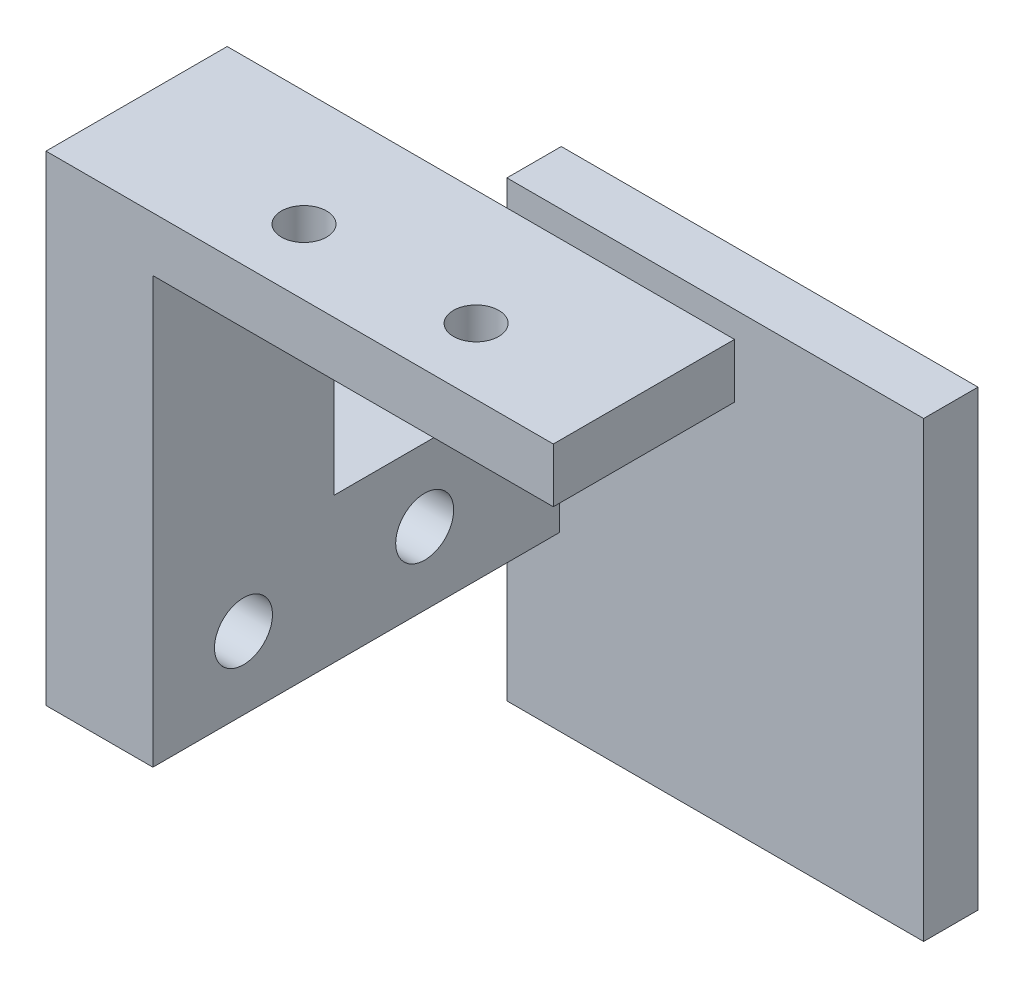
ISO-10303-21;
HEADER;
FILE_DESCRIPTION(('STEP AP214'),'2;1');
FILE_NAME('part.step','',(''),(''),'','','');
FILE_SCHEMA(('AUTOMOTIVE_DESIGN { 1 0 10303 214 1 1 1 1 }'));
ENDSEC;
DATA;
#1=APPLICATION_CONTEXT('core data for automotive mechanical design processes');
#2=APPLICATION_PROTOCOL_DEFINITION('international standard','automotive_design',2000,#1);
#3=PRODUCT_CONTEXT('',#1,'mechanical');
#4=PRODUCT('Part','Part','',(#3));
#5=PRODUCT_RELATED_PRODUCT_CATEGORY('part','',(#4));
#6=PRODUCT_DEFINITION_FORMATION('','',#4);
#7=PRODUCT_DEFINITION_CONTEXT('part definition',#1,'design');
#8=PRODUCT_DEFINITION('design','',#6,#7);
#9=PRODUCT_DEFINITION_SHAPE('','',#8);
#10=(LENGTH_UNIT() NAMED_UNIT(*) SI_UNIT(.MILLI.,.METRE.));
#11=(NAMED_UNIT(*) PLANE_ANGLE_UNIT() SI_UNIT($,.RADIAN.));
#12=(NAMED_UNIT(*) SI_UNIT($,.STERADIAN.) SOLID_ANGLE_UNIT());
#13=UNCERTAINTY_MEASURE_WITH_UNIT(LENGTH_MEASURE(1.E-05),#10,'distance_accuracy_value','');
#14=(GEOMETRIC_REPRESENTATION_CONTEXT(3) GLOBAL_UNCERTAINTY_ASSIGNED_CONTEXT((#13)) GLOBAL_UNIT_ASSIGNED_CONTEXT((#10,
#11,#12)) REPRESENTATION_CONTEXT('',''));
#15=CARTESIAN_POINT('',(0.,0.,0.));
#16=DIRECTION('',(0.,0.,1.));
#17=DIRECTION('',(1.,0.,0.));
#18=AXIS2_PLACEMENT_3D('',#15,#16,#17);
#19=CARTESIAN_POINT('',(10.5,-31.8597532218931,-17.4390504171813));
#20=DIRECTION('',(0.,0.,-1.));
#21=DIRECTION('',(-1.,0.,0.));
#22=AXIS2_PLACEMENT_3D('',#19,#20,#21);
#23=PLANE('',#22);
#24=DIRECTION('',(-1.,0.,0.));
#25=VECTOR('',#24,1.);
#26=CARTESIAN_POINT('',(-9.6,-14.3599627835551,-17.4390504171813));
#27=LINE('',#26,#25);
#28=CARTESIAN_POINT('',(-9.6,-14.3599627835551,-17.4390504171813));
#29=VERTEX_POINT('',#28);
#30=CARTESIAN_POINT('',(-12.5,-14.3599627835551,-17.4390504171813));
#31=VERTEX_POINT('',#30);
#32=EDGE_CURVE('E66',#29,#31,#27,.T.);
#33=ORIENTED_EDGE('',*,*,#32,.F.);
#34=DIRECTION('',(0.,1.,0.));
#35=VECTOR('',#34,1.);
#36=CARTESIAN_POINT('',(-9.6,-14.3599627835551,-17.4390504171813));
#37=LINE('',#36,#35);
#38=CARTESIAN_POINT('',(-9.6,-22.36,-17.4390504171813));
#39=VERTEX_POINT('',#38);
#40=EDGE_CURVE('E433',#39,#29,#37,.T.);
#41=ORIENTED_EDGE('',*,*,#40,.F.);
#42=DIRECTION('',(-1.,0.,0.));
#43=VECTOR('',#42,1.);
#44=CARTESIAN_POINT('',(-9.6,-22.36,-17.4390504171813));
#45=LINE('',#44,#43);
#46=CARTESIAN_POINT('',(-12.5,-22.36,-17.4390504171813));
#47=VERTEX_POINT('',#46);
#48=EDGE_CURVE('E449',#39,#47,#45,.T.);
#49=ORIENTED_EDGE('',*,*,#48,.T.);
#50=DIRECTION('',(0.,-1.,0.));
#51=VECTOR('',#50,1.);
#52=CARTESIAN_POINT('',(-12.5,-31.8597532218931,-17.4390504171813));
#53=LINE('',#52,#51);
#54=CARTESIAN_POINT('',(-12.5,-31.8597532218931,-17.4390504171813));
#55=VERTEX_POINT('',#54);
#56=EDGE_CURVE('E314',#47,#55,#53,.T.);
#57=ORIENTED_EDGE('',*,*,#56,.T.);
#58=DIRECTION('',(-1.,0.,0.));
#59=VECTOR('',#58,1.);
#60=CARTESIAN_POINT('',(10.5,-31.8597532218931,-17.4390504171813));
#61=LINE('',#60,#59);
#62=CARTESIAN_POINT('',(10.5,-31.8597532218931,-17.4390504171813));
#63=VERTEX_POINT('',#62);
#64=EDGE_CURVE('E363',#63,#55,#61,.T.);
#65=ORIENTED_EDGE('',*,*,#64,.F.);
#66=DIRECTION('',(0.,-1.,0.));
#67=VECTOR('',#66,1.);
#68=CARTESIAN_POINT('',(10.5,-31.8597532218931,-17.4390504171813));
#69=LINE('',#68,#67);
#70=CARTESIAN_POINT('',(10.5,-6.85975322189306,-17.4390504171813));
#71=VERTEX_POINT('',#70);
#72=EDGE_CURVE('E323',#71,#63,#69,.T.);
#73=ORIENTED_EDGE('',*,*,#72,.F.);
#74=DIRECTION('',(-1.,0.,0.));
#75=VECTOR('',#74,1.);
#76=CARTESIAN_POINT('',(10.5,-6.85975322189306,-17.4390504171813));
#77=LINE('',#76,#75);
#78=CARTESIAN_POINT('',(-12.5,-6.85975322189306,-17.4390504171813));
#79=VERTEX_POINT('',#78);
#80=EDGE_CURVE('E337',#71,#79,#77,.T.);
#81=ORIENTED_EDGE('',*,*,#80,.T.);
#82=EDGE_CURVE('E338',#79,#31,#53,.T.);
#83=ORIENTED_EDGE('',*,*,#82,.T.);
#84=EDGE_LOOP('',(#33,#41,#49,#57,#65,#73,#81,#83));
#85=FACE_BOUND('',#84,.T.);
#86=ADVANCED_FACE('F48',(#85),#23,.F.);
#87=CARTESIAN_POINT('',(-12.5,0.,0.));
#88=DIRECTION('',(-1.,0.,0.));
#89=DIRECTION('',(0.,0.,1.));
#90=AXIS2_PLACEMENT_3D('',#87,#88,#89);
#91=PLANE('',#90);
#92=DIRECTION('',(0.,1.,0.));
#93=VECTOR('',#92,1.);
#94=CARTESIAN_POINT('',(-12.5,-31.8597532218931,-20.4390504171812));
#95=LINE('',#94,#93);
#96=CARTESIAN_POINT('',(-12.5,-14.3599604516055,-20.4390504171812));
#97=VERTEX_POINT('',#96);
#98=CARTESIAN_POINT('',(-12.5,-6.85975322189306,-20.4390504171812));
#99=VERTEX_POINT('',#98);
#100=EDGE_CURVE('E345',#97,#99,#95,.T.);
#101=ORIENTED_EDGE('',*,*,#100,.F.);
#102=DIRECTION('',(0.,-1.55463304628297E-06,0.999999999998792));
#103=VECTOR('',#102,1.);
#104=CARTESIAN_POINT('',(-12.5,-14.359992226794,-2.23245184601676E-05));
#105=LINE('',#104,#103);
#106=EDGE_CURVE('E11',#97,#31,#105,.T.);
#107=ORIENTED_EDGE('',*,*,#106,.T.);
#108=ORIENTED_EDGE('',*,*,#82,.F.);
#109=DIRECTION('',(0.,0.,1.));
#110=VECTOR('',#109,1.);
#111=CARTESIAN_POINT('',(-12.5,-6.85975322189306,-17.4390504171813));
#112=LINE('',#111,#110);
#113=EDGE_CURVE('E328',#99,#79,#112,.T.);
#114=ORIENTED_EDGE('',*,*,#113,.F.);
#115=EDGE_LOOP('',(#101,#107,#108,#114));
#116=FACE_BOUND('',#115,.T.);
#117=ADVANCED_FACE('F275',(#116),#91,.T.);
#118=CARTESIAN_POINT('',(12.5,3.,5.));
#119=DIRECTION('',(-1.,0.,0.));
#120=DIRECTION('',(0.,0.,1.));
#121=AXIS2_PLACEMENT_3D('',#118,#119,#120);
#122=PLANE('',#121);
#123=DIRECTION('',(0.,-1.,0.));
#124=VECTOR('',#123,1.);
#125=CARTESIAN_POINT('',(12.5,3.,5.));
#126=LINE('',#125,#124);
#127=CARTESIAN_POINT('',(12.5,4.14024677810694,5.));
#128=VERTEX_POINT('',#127);
#129=CARTESIAN_POINT('',(12.5,1.14,5.));
#130=VERTEX_POINT('',#129);
#131=EDGE_CURVE('E197',#128,#130,#126,.T.);
#132=ORIENTED_EDGE('',*,*,#131,.T.);
#133=DIRECTION('',(0.,0.,-1.));
#134=VECTOR('',#133,1.);
#135=CARTESIAN_POINT('',(12.5,1.14,5.));
#136=LINE('',#135,#134);
#137=CARTESIAN_POINT('',(12.5,1.14,-5.));
#138=VERTEX_POINT('',#137);
#139=EDGE_CURVE('E182',#130,#138,#136,.T.);
#140=ORIENTED_EDGE('',*,*,#139,.T.);
#141=DIRECTION('',(0.,-1.,0.));
#142=VECTOR('',#141,1.);
#143=CARTESIAN_POINT('',(12.5,3.,-5.));
#144=LINE('',#143,#142);
#145=CARTESIAN_POINT('',(12.5,4.14024677810694,-5.));
#146=VERTEX_POINT('',#145);
#147=EDGE_CURVE('E58',#146,#138,#144,.T.);
#148=ORIENTED_EDGE('',*,*,#147,.F.);
#149=DIRECTION('',(0.,0.,-1.));
#150=VECTOR('',#149,1.);
#151=CARTESIAN_POINT('',(12.5,4.14024677810694,5.));
#152=LINE('',#151,#150);
#153=EDGE_CURVE('E204',#128,#146,#152,.T.);
#154=ORIENTED_EDGE('',*,*,#153,.F.);
#155=EDGE_LOOP('',(#132,#140,#148,#154));
#156=FACE_BOUND('',#155,.T.);
#157=ADVANCED_FACE('F50',(#156),#122,.F.);
#158=CARTESIAN_POINT('',(-12.5,3.,-5.));
#159=DIRECTION('',(0.,0.,1.));
#160=DIRECTION('',(1.,0.,0.));
#161=AXIS2_PLACEMENT_3D('',#158,#159,#160);
#162=PLANE('',#161);
#163=ORIENTED_EDGE('',*,*,#147,.T.);
#164=DIRECTION('',(1.,0.,0.));
#165=VECTOR('',#164,1.);
#166=CARTESIAN_POINT('',(10.4647507305861,1.14,-5.));
#167=LINE('',#166,#165);
#168=CARTESIAN_POINT('',(-9.6,1.14,-5.));
#169=VERTEX_POINT('',#168);
#170=EDGE_CURVE('E189',#169,#138,#167,.T.);
#171=ORIENTED_EDGE('',*,*,#170,.F.);
#172=DIRECTION('',(0.,1.,0.));
#173=VECTOR('',#172,1.);
#174=CARTESIAN_POINT('',(-9.6,1.14,-5.));
#175=LINE('',#174,#173);
#176=CARTESIAN_POINT('',(-9.6,0.,-5.));
#177=VERTEX_POINT('',#176);
#178=EDGE_CURVE('E546',#177,#169,#175,.T.);
#179=ORIENTED_EDGE('',*,*,#178,.F.);
#180=DIRECTION('',(-1.,0.,0.));
#181=VECTOR('',#180,1.);
#182=CARTESIAN_POINT('',(-9.6,0.,-5.));
#183=LINE('',#182,#181);
#184=CARTESIAN_POINT('',(-12.5,0.,-5.));
#185=VERTEX_POINT('',#184);
#186=EDGE_CURVE('E455',#177,#185,#183,.T.);
#187=ORIENTED_EDGE('',*,*,#186,.T.);
#188=DIRECTION('',(0.,-1.,0.));
#189=VECTOR('',#188,1.);
#190=CARTESIAN_POINT('',(-12.5,0.,-5.));
#191=LINE('',#190,#189);
#192=CARTESIAN_POINT('',(-12.5,-19.359984453629,-5.00002607117806));
#193=VERTEX_POINT('',#192);
#194=EDGE_CURVE('E222',#185,#193,#191,.T.);
#195=ORIENTED_EDGE('',*,*,#194,.T.);
#196=CARTESIAN_POINT('',(-15.5,-19.3599844536155,-5.00003476157075));
#197=DIRECTION('',(1.,0.,0.));
#198=VECTOR('',#197,1.);
#199=LINE('',#196,#198);
#200=CARTESIAN_POINT('',(-15.5,-19.3599863969338,-5.00001738078537));
#201=VERTEX_POINT('',#200);
#202=EDGE_CURVE('E235',#201,#193,#199,.T.);
#203=ORIENTED_EDGE('',*,*,#202,.F.);
#204=DIRECTION('',(0.,-1.,0.));
#205=VECTOR('',#204,1.);
#206=CARTESIAN_POINT('',(-15.5,0.,-5.));
#207=LINE('',#206,#205);
#208=CARTESIAN_POINT('',(-15.5,4.14024677810694,-5.));
#209=VERTEX_POINT('',#208);
#210=EDGE_CURVE('E214',#209,#201,#207,.T.);
#211=ORIENTED_EDGE('',*,*,#210,.F.);
#212=DIRECTION('',(1.,0.,0.));
#213=VECTOR('',#212,1.);
#214=CARTESIAN_POINT('',(12.5,4.14024677810694,-5.));
#215=LINE('',#214,#213);
#216=EDGE_CURVE('E418',#209,#146,#215,.T.);
#217=ORIENTED_EDGE('',*,*,#216,.T.);
#218=EDGE_LOOP('',(#163,#171,#179,#187,#195,#203,#211,#217));
#219=FACE_BOUND('',#218,.T.);
#220=ADVANCED_FACE('F240',(#219),#162,.F.);
#221=CARTESIAN_POINT('',(-12.5,3.,5.));
#222=DIRECTION('',(0.,0.,-1.));
#223=DIRECTION('',(-1.,0.,0.));
#224=AXIS2_PLACEMENT_3D('',#221,#222,#223);
#225=PLANE('',#224);
#226=DIRECTION('',(0.,-1.,0.));
#227=VECTOR('',#226,1.);
#228=CARTESIAN_POINT('',(-9.6,-22.36,5.));
#229=LINE('',#228,#227);
#230=CARTESIAN_POINT('',(-9.6,1.14,5.));
#231=VERTEX_POINT('',#230);
#232=CARTESIAN_POINT('',(-9.6,-22.36,5.));
#233=VERTEX_POINT('',#232);
#234=EDGE_CURVE('E200',#231,#233,#229,.T.);
#235=ORIENTED_EDGE('',*,*,#234,.F.);
#236=DIRECTION('',(1.,0.,0.));
#237=VECTOR('',#236,1.);
#238=CARTESIAN_POINT('',(12.5,1.14,5.));
#239=LINE('',#238,#237);
#240=EDGE_CURVE('E186',#231,#130,#239,.T.);
#241=ORIENTED_EDGE('',*,*,#240,.T.);
#242=ORIENTED_EDGE('',*,*,#131,.F.);
#243=DIRECTION('',(1.,0.,0.));
#244=VECTOR('',#243,1.);
#245=CARTESIAN_POINT('',(12.5,4.14024677810694,5.));
#246=LINE('',#245,#244);
#247=CARTESIAN_POINT('',(-15.5,4.14024677810694,5.));
#248=VERTEX_POINT('',#247);
#249=EDGE_CURVE('E416',#248,#128,#246,.T.);
#250=ORIENTED_EDGE('',*,*,#249,.F.);
#251=DIRECTION('',(0.,1.,0.));
#252=VECTOR('',#251,1.);
#253=CARTESIAN_POINT('',(-15.5,0.,5.));
#254=LINE('',#253,#252);
#255=CARTESIAN_POINT('',(-15.5,-22.36,5.));
#256=VERTEX_POINT('',#255);
#257=EDGE_CURVE('E73',#256,#248,#254,.T.);
#258=ORIENTED_EDGE('',*,*,#257,.F.);
#259=DIRECTION('',(-1.,0.,0.));
#260=VECTOR('',#259,1.);
#261=CARTESIAN_POINT('',(-12.5,-22.36,5.));
#262=LINE('',#261,#260);
#263=EDGE_CURVE('E227',#233,#256,#262,.T.);
#264=ORIENTED_EDGE('',*,*,#263,.F.);
#265=EDGE_LOOP('',(#235,#241,#242,#250,#258,#264));
#266=FACE_BOUND('',#265,.T.);
#267=ADVANCED_FACE('F196',(#266),#225,.F.);
#268=CARTESIAN_POINT('',(-15.5,0.,0.));
#269=DIRECTION('',(1.,0.,0.));
#270=DIRECTION('',(0.,0.,-1.));
#271=AXIS2_PLACEMENT_3D('',#268,#269,#270);
#272=PLANE('',#271);
#273=CARTESIAN_POINT('',(-15.5,-18.3599863310528,-1.82108169364571E-05));
#274=DIRECTION('',(-1.,0.,0.));
#275=DIRECTION('',(0.,0.,1.));
#276=AXIS2_PLACEMENT_3D('',#273,#274,#275);
#277=CIRCLE('',#276,1.6);
#278=CARTESIAN_POINT('',(-15.5,-18.3599863310528,1.59998178918306));
#279=VERTEX_POINT('',#278);
#280=EDGE_CURVE('E577',#279,#279,#277,.T.);
#281=ORIENTED_EDGE('',*,*,#280,.F.);
#282=EDGE_LOOP('',(#281));
#283=FACE_BOUND('',#282,.T.);
#284=CARTESIAN_POINT('',(-15.5,-18.3599922268108,-10.0000134942028));
#285=DIRECTION('',(-1.,0.,0.));
#286=DIRECTION('',(0.,0.,1.));
#287=AXIS2_PLACEMENT_3D('',#284,#285,#286);
#288=CIRCLE('',#287,1.6);
#289=CARTESIAN_POINT('',(-15.5,-18.3599922268108,-8.40001349420275));
#290=VERTEX_POINT('',#289);
#291=EDGE_CURVE('E574',#290,#290,#288,.T.);
#292=ORIENTED_EDGE('',*,*,#291,.F.);
#293=EDGE_LOOP('',(#292));
#294=FACE_BOUND('',#293,.T.);
#295=ORIENTED_EDGE('',*,*,#257,.T.);
#296=DIRECTION('',(0.,0.,-1.));
#297=VECTOR('',#296,1.);
#298=CARTESIAN_POINT('',(-15.5,4.14024677810694,5.));
#299=LINE('',#298,#297);
#300=EDGE_CURVE('E412',#248,#209,#299,.T.);
#301=ORIENTED_EDGE('',*,*,#300,.T.);
#302=ORIENTED_EDGE('',*,*,#210,.T.);
#303=DIRECTION('',(0.,-0.999999999998792,-1.55463304636467E-06));
#304=VECTOR('',#303,1.);
#305=CARTESIAN_POINT('',(-15.5,-14.3599844536215,-5.00002698840552));
#306=LINE('',#305,#304);
#307=CARTESIAN_POINT('',(-15.5,-14.3599844536215,-5.00002698840552));
#308=VERTEX_POINT('',#307);
#309=EDGE_CURVE('E305',#308,#201,#306,.T.);
#310=ORIENTED_EDGE('',*,*,#309,.F.);
#311=DIRECTION('',(0.,-1.55463304628297E-06,0.999999999998792));
#312=VECTOR('',#311,1.);
#313=CARTESIAN_POINT('',(-15.5,-14.3599844536215,-5.00002698840552));
#314=LINE('',#313,#312);
#315=CARTESIAN_POINT('',(-15.5,-14.3599604515874,-20.4390620772512));
#316=VERTEX_POINT('',#315);
#317=EDGE_CURVE('E464',#316,#308,#314,.T.);
#318=ORIENTED_EDGE('',*,*,#317,.F.);
#319=DIRECTION('',(0.,-0.999999999998792,-1.55463304636467E-06));
#320=VECTOR('',#319,1.);
#321=CARTESIAN_POINT('',(-15.5,-14.3599604515874,-20.4390620772512));
#322=LINE('',#321,#320);
#323=CARTESIAN_POINT('',(-15.5,-19.3599604515813,-20.4390698504165));
#324=VERTEX_POINT('',#323);
#325=EDGE_CURVE('E403',#316,#324,#322,.T.);
#326=ORIENTED_EDGE('',*,*,#325,.T.);
#327=DIRECTION('',(0.,-1.55463304628297E-06,0.999999999998792));
#328=VECTOR('',#327,1.);
#329=CARTESIAN_POINT('',(-15.5,-19.3599844536155,-5.00003476157075));
#330=LINE('',#329,#328);
#331=CARTESIAN_POINT('',(-15.5,-19.3599604516116,-20.439050417174));
#332=VERTEX_POINT('',#331);
#333=EDGE_CURVE('E395',#324,#332,#330,.T.);
#334=ORIENTED_EDGE('',*,*,#333,.T.);
#335=DIRECTION('',(0.,-1.,0.));
#336=VECTOR('',#335,1.);
#337=CARTESIAN_POINT('',(-15.5,-19.3599651155107,-20.4390504171812));
#338=LINE('',#337,#336);
#339=CARTESIAN_POINT('',(-15.5,-22.36,-20.4390504171812));
#340=VERTEX_POINT('',#339);
#341=EDGE_CURVE('E367',#332,#340,#338,.T.);
#342=ORIENTED_EDGE('',*,*,#341,.T.);
#343=DIRECTION('',(0.,0.,1.));
#344=VECTOR('',#343,1.);
#345=CARTESIAN_POINT('',(-15.5,-22.36,5.));
#346=LINE('',#345,#344);
#347=EDGE_CURVE('E373',#340,#256,#346,.T.);
#348=ORIENTED_EDGE('',*,*,#347,.T.);
#349=EDGE_LOOP('',(#295,#301,#302,#310,#318,#326,#334,#342,#348));
#350=FACE_BOUND('',#349,.T.);
#351=ADVANCED_FACE('F251',(#283,#294,#350),#272,.F.);
#352=CARTESIAN_POINT('',(-12.5,-22.36,5.));
#353=DIRECTION('',(0.,-1.,0.));
#354=DIRECTION('',(0.,0.,-1.));
#355=AXIS2_PLACEMENT_3D('',#352,#353,#354);
#356=PLANE('',#355);
#357=ORIENTED_EDGE('',*,*,#347,.F.);
#358=DIRECTION('',(-1.,0.,0.));
#359=VECTOR('',#358,1.);
#360=CARTESIAN_POINT('',(-12.5,-22.36,-20.4390504171812));
#361=LINE('',#360,#359);
#362=CARTESIAN_POINT('',(-12.5,-22.36,-20.4390504171812));
#363=VERTEX_POINT('',#362);
#364=EDGE_CURVE('E382',#363,#340,#361,.T.);
#365=ORIENTED_EDGE('',*,*,#364,.F.);
#366=DIRECTION('',(0.,0.,1.));
#367=VECTOR('',#366,1.);
#368=CARTESIAN_POINT('',(-12.5,-22.36,-20.4390504171812));
#369=LINE('',#368,#367);
#370=EDGE_CURVE('E368',#363,#47,#369,.T.);
#371=ORIENTED_EDGE('',*,*,#370,.T.);
#372=ORIENTED_EDGE('',*,*,#48,.F.);
#373=DIRECTION('',(0.,0.,-1.));
#374=VECTOR('',#373,1.);
#375=CARTESIAN_POINT('',(-9.6,-22.36,-17.4390504171813));
#376=LINE('',#375,#374);
#377=EDGE_CURVE('E446',#233,#39,#376,.T.);
#378=ORIENTED_EDGE('',*,*,#377,.F.);
#379=ORIENTED_EDGE('',*,*,#263,.T.);
#380=EDGE_LOOP('',(#357,#365,#371,#372,#378,#379));
#381=FACE_BOUND('',#380,.T.);
#382=ADVANCED_FACE('F263',(#381),#356,.T.);
#383=CARTESIAN_POINT('',(-12.5,-19.3599651155107,-20.4390504171812));
#384=DIRECTION('',(0.,0.,-1.));
#385=DIRECTION('',(-1.,0.,0.));
#386=AXIS2_PLACEMENT_3D('',#383,#384,#385);
#387=PLANE('',#386);
#388=ORIENTED_EDGE('',*,*,#341,.F.);
#389=DIRECTION('',(-1.,0.,0.));
#390=VECTOR('',#389,1.);
#391=CARTESIAN_POINT('',(-12.5,-19.3599651155107,-20.4390504171812));
#392=LINE('',#391,#390);
#393=CARTESIAN_POINT('',(-12.5,-19.3599604516116,-20.4390504171812));
#394=VERTEX_POINT('',#393);
#395=EDGE_CURVE('E372',#394,#332,#392,.T.);
#396=ORIENTED_EDGE('',*,*,#395,.F.);
#397=EDGE_CURVE('E350',#394,#97,#95,.T.);
#398=ORIENTED_EDGE('',*,*,#397,.T.);
#399=ORIENTED_EDGE('',*,*,#100,.T.);
#400=DIRECTION('',(-1.,0.,0.));
#401=VECTOR('',#400,1.);
#402=CARTESIAN_POINT('',(10.5,-6.85975322189306,-20.4390504171812));
#403=LINE('',#402,#401);
#404=CARTESIAN_POINT('',(10.5,-6.85975322189306,-20.4390504171812));
#405=VERTEX_POINT('',#404);
#406=EDGE_CURVE('E356',#405,#99,#403,.T.);
#407=ORIENTED_EDGE('',*,*,#406,.F.);
#408=DIRECTION('',(0.,1.,0.));
#409=VECTOR('',#408,1.);
#410=CARTESIAN_POINT('',(10.5,-31.8597532218931,-20.4390504171812));
#411=LINE('',#410,#409);
#412=CARTESIAN_POINT('',(10.5,-31.8597532218931,-20.4390504171812));
#413=VERTEX_POINT('',#412);
#414=EDGE_CURVE('E331',#413,#405,#411,.T.);
#415=ORIENTED_EDGE('',*,*,#414,.F.);
#416=DIRECTION('',(-1.,0.,0.));
#417=VECTOR('',#416,1.);
#418=CARTESIAN_POINT('',(10.5,-31.8597532218931,-20.4390504171812));
#419=LINE('',#418,#417);
#420=CARTESIAN_POINT('',(-12.5,-31.8597532218931,-20.4390504171812));
#421=VERTEX_POINT('',#420);
#422=EDGE_CURVE('E359',#413,#421,#419,.T.);
#423=ORIENTED_EDGE('',*,*,#422,.T.);
#424=EDGE_CURVE('E346',#421,#363,#95,.T.);
#425=ORIENTED_EDGE('',*,*,#424,.T.);
#426=ORIENTED_EDGE('',*,*,#364,.T.);
#427=EDGE_LOOP('',(#388,#396,#398,#399,#407,#415,#423,#425,#426));
#428=FACE_BOUND('',#427,.T.);
#429=ADVANCED_FACE('F265',(#428),#387,.T.);
#430=ORIENTED_EDGE('',*,*,#56,.F.);
#431=ORIENTED_EDGE('',*,*,#370,.F.);
#432=ORIENTED_EDGE('',*,*,#424,.F.);
#433=DIRECTION('',(0.,0.,-1.));
#434=VECTOR('',#433,1.);
#435=CARTESIAN_POINT('',(-12.5,-31.8597532218931,-17.4390504171813));
#436=LINE('',#435,#434);
#437=EDGE_CURVE('E342',#55,#421,#436,.T.);
#438=ORIENTED_EDGE('',*,*,#437,.F.);
#439=EDGE_LOOP('',(#430,#431,#432,#438));
#440=FACE_BOUND('',#439,.T.);
#441=ADVANCED_FACE('F268',(#440),#91,.T.);
#442=CARTESIAN_POINT('',(10.5,-31.8597532218931,-17.4390504171813));
#443=DIRECTION('',(0.,1.,0.));
#444=DIRECTION('',(0.,0.,1.));
#445=AXIS2_PLACEMENT_3D('',#442,#443,#444);
#446=PLANE('',#445);
#447=ORIENTED_EDGE('',*,*,#437,.T.);
#448=ORIENTED_EDGE('',*,*,#422,.F.);
#449=DIRECTION('',(0.,0.,-1.));
#450=VECTOR('',#449,1.);
#451=CARTESIAN_POINT('',(10.5,-31.8597532218931,-17.4390504171813));
#452=LINE('',#451,#450);
#453=EDGE_CURVE('E327',#63,#413,#452,.T.);
#454=ORIENTED_EDGE('',*,*,#453,.F.);
#455=ORIENTED_EDGE('',*,*,#64,.T.);
#456=EDGE_LOOP('',(#447,#448,#454,#455));
#457=FACE_BOUND('',#456,.T.);
#458=ADVANCED_FACE('F277',(#457),#446,.F.);
#459=CARTESIAN_POINT('',(10.5,-6.85975322189306,-17.4390504171813));
#460=DIRECTION('',(0.,-1.,0.));
#461=DIRECTION('',(0.,0.,-1.));
#462=AXIS2_PLACEMENT_3D('',#459,#460,#461);
#463=PLANE('',#462);
#464=ORIENTED_EDGE('',*,*,#113,.T.);
#465=ORIENTED_EDGE('',*,*,#80,.F.);
#466=DIRECTION('',(0.,0.,1.));
#467=VECTOR('',#466,1.);
#468=CARTESIAN_POINT('',(10.5,-6.85975322189306,-17.4390504171813));
#469=LINE('',#468,#467);
#470=EDGE_CURVE('E334',#405,#71,#469,.T.);
#471=ORIENTED_EDGE('',*,*,#470,.F.);
#472=ORIENTED_EDGE('',*,*,#406,.T.);
#473=EDGE_LOOP('',(#464,#465,#471,#472));
#474=FACE_BOUND('',#473,.T.);
#475=ADVANCED_FACE('F280',(#474),#463,.F.);
#476=CARTESIAN_POINT('',(10.5,0.,0.));
#477=DIRECTION('',(-1.,0.,0.));
#478=DIRECTION('',(0.,0.,1.));
#479=AXIS2_PLACEMENT_3D('',#476,#477,#478);
#480=PLANE('',#479);
#481=ORIENTED_EDGE('',*,*,#72,.T.);
#482=ORIENTED_EDGE('',*,*,#453,.T.);
#483=ORIENTED_EDGE('',*,*,#414,.T.);
#484=ORIENTED_EDGE('',*,*,#470,.T.);
#485=EDGE_LOOP('',(#481,#482,#483,#484));
#486=FACE_BOUND('',#485,.T.);
#487=ADVANCED_FACE('F284',(#486),#480,.F.);
#488=CARTESIAN_POINT('',(-15.5,-14.3599844536215,-5.00002698840552));
#489=DIRECTION('',(0.,1.55463304636467E-06,-0.999999999998792));
#490=DIRECTION('',(0.,0.999999999998792,1.55463304636467E-06));
#491=AXIS2_PLACEMENT_3D('',#488,#489,#490);
#492=PLANE('',#491);
#493=ORIENTED_EDGE('',*,*,#202,.T.);
#494=DIRECTION('',(0.,-0.999999999998792,-1.55463304636467E-06));
#495=VECTOR('',#494,1.);
#496=CARTESIAN_POINT('',(-12.5,-14.3599844536215,-5.00002698840552));
#497=LINE('',#496,#495);
#498=CARTESIAN_POINT('',(-12.5,-14.3599844536215,-5.00002698840552));
#499=VERTEX_POINT('',#498);
#500=EDGE_CURVE('E315',#499,#193,#497,.T.);
#501=ORIENTED_EDGE('',*,*,#500,.F.);
#502=DIRECTION('',(1.,0.,0.));
#503=VECTOR('',#502,1.);
#504=CARTESIAN_POINT('',(-15.5,-14.3599844536215,-5.00002698840552));
#505=LINE('',#504,#503);
#506=EDGE_CURVE('E468',#308,#499,#505,.T.);
#507=ORIENTED_EDGE('',*,*,#506,.F.);
#508=ORIENTED_EDGE('',*,*,#309,.T.);
#509=EDGE_LOOP('',(#493,#501,#507,#508));
#510=FACE_BOUND('',#509,.T.);
#511=ADVANCED_FACE('F291',(#510),#492,.F.);
#512=CARTESIAN_POINT('',(-12.5,-14.3599844536215,-5.00002698840552));
#513=DIRECTION('',(-1.,0.,0.));
#514=DIRECTION('',(0.,0.,1.));
#515=AXIS2_PLACEMENT_3D('',#512,#513,#514);
#516=PLANE('',#515);
#517=ORIENTED_EDGE('',*,*,#397,.F.);
#518=DIRECTION('',(0.,1.55463304628297E-06,-0.999999999998792));
#519=VECTOR('',#518,1.);
#520=CARTESIAN_POINT('',(-12.5,-19.3599844536155,-5.00003476157075));
#521=LINE('',#520,#519);
#522=CARTESIAN_POINT('',(-12.5,-19.3599604515813,-20.4390698504165));
#523=VERTEX_POINT('',#522);
#524=EDGE_CURVE('E396',#394,#523,#521,.T.);
#525=ORIENTED_EDGE('',*,*,#524,.T.);
#526=DIRECTION('',(0.,-0.999999999998792,-1.55463304636467E-06));
#527=VECTOR('',#526,1.);
#528=CARTESIAN_POINT('',(-12.5,-14.3599604515874,-20.4390620772512));
#529=LINE('',#528,#527);
#530=CARTESIAN_POINT('',(-12.5,-14.3599604515874,-20.4390620772512));
#531=VERTEX_POINT('',#530);
#532=EDGE_CURVE('E320',#531,#523,#529,.T.);
#533=ORIENTED_EDGE('',*,*,#532,.F.);
#534=DIRECTION('',(0.,1.55463304628297E-06,-0.999999999998792));
#535=VECTOR('',#534,1.);
#536=CARTESIAN_POINT('',(-12.5,-14.3599844536215,-5.00002698840552));
#537=LINE('',#536,#535);
#538=EDGE_CURVE('E473',#97,#531,#537,.T.);
#539=ORIENTED_EDGE('',*,*,#538,.F.);
#540=EDGE_LOOP('',(#517,#525,#533,#539));
#541=FACE_BOUND('',#540,.T.);
#542=ADVANCED_FACE('F296',(#541),#516,.F.);
#543=CARTESIAN_POINT('',(-15.5,-14.3599604515874,-20.4390620772512));
#544=DIRECTION('',(0.,-1.55463304636467E-06,0.999999999998792));
#545=DIRECTION('',(0.,-0.999999999998792,-1.55463304636467E-06));
#546=AXIS2_PLACEMENT_3D('',#543,#544,#545);
#547=PLANE('',#546);
#548=DIRECTION('',(-1.,0.,0.));
#549=VECTOR('',#548,1.);
#550=CARTESIAN_POINT('',(-15.5,-19.3599604515813,-20.4390698504165));
#551=LINE('',#550,#549);
#552=EDGE_CURVE('E469',#523,#324,#551,.T.);
#553=ORIENTED_EDGE('',*,*,#552,.T.);
#554=ORIENTED_EDGE('',*,*,#325,.F.);
#555=DIRECTION('',(-1.,0.,0.));
#556=VECTOR('',#555,1.);
#557=CARTESIAN_POINT('',(-15.5,-14.3599604515874,-20.4390620772512));
#558=LINE('',#557,#556);
#559=EDGE_CURVE('E476',#531,#316,#558,.T.);
#560=ORIENTED_EDGE('',*,*,#559,.F.);
#561=ORIENTED_EDGE('',*,*,#532,.T.);
#562=EDGE_LOOP('',(#553,#554,#560,#561));
#563=FACE_BOUND('',#562,.T.);
#564=ADVANCED_FACE('F489',(#563),#547,.F.);
#565=CARTESIAN_POINT('',(0.,-14.359992226794,-2.23245184597591E-05));
#566=DIRECTION('',(0.,-0.999999999998792,-1.55463304628297E-06));
#567=DIRECTION('',(0.,1.55463304628297E-06,-0.999999999998792));
#568=AXIS2_PLACEMENT_3D('',#565,#566,#567);
#569=PLANE('',#568);
#570=ORIENTED_EDGE('',*,*,#317,.T.);
#571=ORIENTED_EDGE('',*,*,#506,.T.);
#572=DIRECTION('',(-1.,0.,0.));
#573=VECTOR('',#572,1.);
#574=CARTESIAN_POINT('',(-9.6,-14.3599844536215,-5.00002698840552));
#575=LINE('',#574,#573);
#576=CARTESIAN_POINT('',(-9.6,-14.3599844536215,-5.00002698840552));
#577=VERTEX_POINT('',#576);
#578=EDGE_CURVE('E459',#577,#499,#575,.T.);
#579=ORIENTED_EDGE('',*,*,#578,.F.);
#580=DIRECTION('',(0.,-1.74210351631287E-06,0.999999999998483));
#581=VECTOR('',#580,1.);
#582=CARTESIAN_POINT('',(-9.6,-14.3599844536215,-5.00002698840552));
#583=LINE('',#582,#581);
#584=EDGE_CURVE('E437',#29,#577,#583,.T.);
#585=ORIENTED_EDGE('',*,*,#584,.F.);
#586=ORIENTED_EDGE('',*,*,#32,.T.);
#587=ORIENTED_EDGE('',*,*,#106,.F.);
#588=ORIENTED_EDGE('',*,*,#538,.T.);
#589=ORIENTED_EDGE('',*,*,#559,.T.);
#590=EDGE_LOOP('',(#570,#571,#579,#585,#586,#587,#588,#589));
#591=FACE_BOUND('',#590,.T.);
#592=ADVANCED_FACE('F609',(#591),#569,.F.);
#593=CARTESIAN_POINT('',(0.,-19.359992226788,-3.00976836915825E-05));
#594=DIRECTION('',(0.,-0.999999999998792,-1.55463304628297E-06));
#595=DIRECTION('',(0.,1.55463304628297E-06,-0.999999999998792));
#596=AXIS2_PLACEMENT_3D('',#593,#594,#595);
#597=PLANE('',#596);
#598=ORIENTED_EDGE('',*,*,#524,.F.);
#599=ORIENTED_EDGE('',*,*,#395,.T.);
#600=ORIENTED_EDGE('',*,*,#333,.F.);
#601=ORIENTED_EDGE('',*,*,#552,.F.);
#602=EDGE_LOOP('',(#598,#599,#600,#601));
#603=FACE_BOUND('',#602,.T.);
#604=ADVANCED_FACE('F393',(#603),#597,.T.);
#605=CARTESIAN_POINT('',(-12.5,0.,0.));
#606=DIRECTION('',(-1.,0.,0.));
#607=DIRECTION('',(0.,0.,1.));
#608=AXIS2_PLACEMENT_3D('',#605,#606,#607);
#609=PLANE('',#608);
#610=ORIENTED_EDGE('',*,*,#194,.F.);
#611=DIRECTION('',(0.,0.999999999998234,1.87941746062448E-06));
#612=VECTOR('',#611,1.);
#613=CARTESIAN_POINT('',(-12.5,0.,-5.));
#614=LINE('',#613,#612);
#615=EDGE_CURVE('E431',#499,#185,#614,.T.);
#616=ORIENTED_EDGE('',*,*,#615,.F.);
#617=ORIENTED_EDGE('',*,*,#500,.T.);
#618=EDGE_LOOP('',(#610,#616,#617));
#619=FACE_BOUND('',#618,.T.);
#620=ADVANCED_FACE('F602',(#619),#609,.T.);
#621=CARTESIAN_POINT('',(-9.6,0.,-5.));
#622=DIRECTION('',(0.,-1.87941746062448E-06,0.999999999998234));
#623=DIRECTION('',(0.,-0.999999999998234,-1.87941746062448E-06));
#624=AXIS2_PLACEMENT_3D('',#621,#622,#623);
#625=PLANE('',#624);
#626=ORIENTED_EDGE('',*,*,#615,.T.);
#627=ORIENTED_EDGE('',*,*,#186,.F.);
#628=DIRECTION('',(0.,0.999999999998234,1.87941746062448E-06));
#629=VECTOR('',#628,1.);
#630=CARTESIAN_POINT('',(-9.6,0.,-5.));
#631=LINE('',#630,#629);
#632=EDGE_CURVE('E440',#577,#177,#631,.T.);
#633=ORIENTED_EDGE('',*,*,#632,.F.);
#634=ORIENTED_EDGE('',*,*,#578,.T.);
#635=EDGE_LOOP('',(#626,#627,#633,#634));
#636=FACE_BOUND('',#635,.T.);
#637=ADVANCED_FACE('F600',(#636),#625,.F.);
#638=CARTESIAN_POINT('',(-9.6,0.,0.));
#639=DIRECTION('',(-1.,0.,0.));
#640=DIRECTION('',(0.,0.,1.));
#641=AXIS2_PLACEMENT_3D('',#638,#639,#640);
#642=PLANE('',#641);
#643=CARTESIAN_POINT('',(-9.6,-18.3599863310528,-1.82108169364571E-05));
#644=DIRECTION('',(-1.,0.,0.));
#645=DIRECTION('',(0.,0.,1.));
#646=AXIS2_PLACEMENT_3D('',#643,#644,#645);
#647=CIRCLE('',#646,1.6);
#648=CARTESIAN_POINT('',(-9.6,-18.3599863310528,1.59998178918306));
#649=VERTEX_POINT('',#648);
#650=EDGE_CURVE('E52',#649,#649,#647,.T.);
#651=ORIENTED_EDGE('',*,*,#650,.T.);
#652=EDGE_LOOP('',(#651));
#653=FACE_BOUND('',#652,.T.);
#654=CARTESIAN_POINT('',(-9.6,-18.3599922268108,-10.0000134942028));
#655=DIRECTION('',(-1.,0.,0.));
#656=DIRECTION('',(0.,0.,1.));
#657=AXIS2_PLACEMENT_3D('',#654,#655,#656);
#658=CIRCLE('',#657,1.6);
#659=CARTESIAN_POINT('',(-9.6,-18.3599922268108,-8.40001349420275));
#660=VERTEX_POINT('',#659);
#661=EDGE_CURVE('E570',#660,#660,#658,.T.);
#662=ORIENTED_EDGE('',*,*,#661,.T.);
#663=EDGE_LOOP('',(#662));
#664=FACE_BOUND('',#663,.T.);
#665=ORIENTED_EDGE('',*,*,#40,.T.);
#666=ORIENTED_EDGE('',*,*,#584,.T.);
#667=ORIENTED_EDGE('',*,*,#632,.T.);
#668=ORIENTED_EDGE('',*,*,#178,.T.);
#669=DIRECTION('',(0.,0.,-1.));
#670=VECTOR('',#669,1.);
#671=CARTESIAN_POINT('',(-9.6,1.14,5.));
#672=LINE('',#671,#670);
#673=EDGE_CURVE('E194',#231,#169,#672,.T.);
#674=ORIENTED_EDGE('',*,*,#673,.F.);
#675=ORIENTED_EDGE('',*,*,#234,.T.);
#676=ORIENTED_EDGE('',*,*,#377,.T.);
#677=EDGE_LOOP('',(#665,#666,#667,#668,#674,#675,#676));
#678=FACE_BOUND('',#677,.T.);
#679=ADVANCED_FACE('F592',(#653,#664,#678),#642,.F.);
#680=CARTESIAN_POINT('',(12.5,4.14024677810694,5.));
#681=DIRECTION('',(0.,1.,0.));
#682=DIRECTION('',(0.,0.,1.));
#683=AXIS2_PLACEMENT_3D('',#680,#681,#682);
#684=PLANE('',#683);
#685=CARTESIAN_POINT('',(-4.8941366162008,4.14024677810694,1.36693397460551));
#686=DIRECTION('',(0.,1.,0.));
#687=DIRECTION('',(0.,0.,1.));
#688=AXIS2_PLACEMENT_3D('',#685,#686,#687);
#689=CIRCLE('',#688,1.25);
#690=CARTESIAN_POINT('',(-4.8941366162008,4.14024677810694,2.61693397460551));
#691=VERTEX_POINT('',#690);
#692=EDGE_CURVE('E549',#691,#691,#689,.T.);
#693=ORIENTED_EDGE('',*,*,#692,.F.);
#694=EDGE_LOOP('',(#693));
#695=FACE_BOUND('',#694,.T.);
#696=CARTESIAN_POINT('',(4.6058633837992,4.14024677810694,1.36693397460564));
#697=DIRECTION('',(0.,1.,0.));
#698=DIRECTION('',(0.,0.,1.));
#699=AXIS2_PLACEMENT_3D('',#696,#697,#698);
#700=CIRCLE('',#699,1.25);
#701=CARTESIAN_POINT('',(4.6058633837992,4.14024677810694,2.61693397460564));
#702=VERTEX_POINT('',#701);
#703=EDGE_CURVE('E563',#702,#702,#700,.T.);
#704=ORIENTED_EDGE('',*,*,#703,.F.);
#705=EDGE_LOOP('',(#704));
#706=FACE_BOUND('',#705,.T.);
#707=ORIENTED_EDGE('',*,*,#216,.F.);
#708=ORIENTED_EDGE('',*,*,#300,.F.);
#709=ORIENTED_EDGE('',*,*,#249,.T.);
#710=ORIENTED_EDGE('',*,*,#153,.T.);
#711=EDGE_LOOP('',(#707,#708,#709,#710));
#712=FACE_BOUND('',#711,.T.);
#713=ADVANCED_FACE('F415',(#695,#706,#712),#684,.T.);
#714=CARTESIAN_POINT('',(10.4647507305861,1.14,5.));
#715=DIRECTION('',(0.,1.,0.));
#716=DIRECTION('',(0.,0.,1.));
#717=AXIS2_PLACEMENT_3D('',#714,#715,#716);
#718=PLANE('',#717);
#719=CARTESIAN_POINT('',(-4.8941366162008,1.14,1.36693397460551));
#720=DIRECTION('',(0.,1.,0.));
#721=DIRECTION('',(0.,0.,1.));
#722=AXIS2_PLACEMENT_3D('',#719,#720,#721);
#723=CIRCLE('',#722,1.25);
#724=CARTESIAN_POINT('',(-4.8941366162008,1.14,2.61693397460551));
#725=VERTEX_POINT('',#724);
#726=EDGE_CURVE('E239',#725,#725,#723,.F.);
#727=ORIENTED_EDGE('',*,*,#726,.F.);
#728=EDGE_LOOP('',(#727));
#729=FACE_BOUND('',#728,.T.);
#730=ORIENTED_EDGE('',*,*,#170,.T.);
#731=ORIENTED_EDGE('',*,*,#139,.F.);
#732=ORIENTED_EDGE('',*,*,#240,.F.);
#733=ORIENTED_EDGE('',*,*,#673,.T.);
#734=EDGE_LOOP('',(#730,#731,#732,#733));
#735=FACE_BOUND('',#734,.T.);
#736=CARTESIAN_POINT('',(4.6058633837992,1.14,1.36693397460564));
#737=DIRECTION('',(0.,1.,0.));
#738=DIRECTION('',(0.,0.,1.));
#739=AXIS2_PLACEMENT_3D('',#736,#737,#738);
#740=CIRCLE('',#739,1.25);
#741=CARTESIAN_POINT('',(4.6058633837992,1.14,2.61693397460564));
#742=VERTEX_POINT('',#741);
#743=EDGE_CURVE('E426',#742,#742,#740,.F.);
#744=ORIENTED_EDGE('',*,*,#743,.F.);
#745=EDGE_LOOP('',(#744));
#746=FACE_BOUND('',#745,.T.);
#747=ADVANCED_FACE('F184',(#729,#735,#746),#718,.F.);
#748=CARTESIAN_POINT('',(-4.8941366162008,-7.,1.36693397460551));
#749=DIRECTION('',(0.,1.,0.));
#750=DIRECTION('',(0.,0.,1.));
#751=AXIS2_PLACEMENT_3D('',#748,#749,#750);
#752=CYLINDRICAL_SURFACE('',#751,1.25);
#753=ORIENTED_EDGE('',*,*,#726,.T.);
#754=EDGE_LOOP('',(#753));
#755=FACE_BOUND('',#754,.T.);
#756=ORIENTED_EDGE('',*,*,#692,.T.);
#757=EDGE_LOOP('',(#756));
#758=FACE_BOUND('',#757,.T.);
#759=ADVANCED_FACE('F256',(#755,#758),#752,.F.);
#760=CARTESIAN_POINT('',(4.6058633837992,-7.,1.36693397460564));
#761=DIRECTION('',(0.,1.,0.));
#762=DIRECTION('',(0.,0.,1.));
#763=AXIS2_PLACEMENT_3D('',#760,#761,#762);
#764=CYLINDRICAL_SURFACE('',#763,1.25);
#765=ORIENTED_EDGE('',*,*,#743,.T.);
#766=EDGE_LOOP('',(#765));
#767=FACE_BOUND('',#766,.T.);
#768=ORIENTED_EDGE('',*,*,#703,.T.);
#769=EDGE_LOOP('',(#768));
#770=FACE_BOUND('',#769,.T.);
#771=ADVANCED_FACE('F252',(#767,#770),#764,.F.);
#772=CARTESIAN_POINT('',(24.5,-18.3599922268108,-10.0000134942028));
#773=DIRECTION('',(-1.,0.,0.));
#774=DIRECTION('',(0.,0.,1.));
#775=AXIS2_PLACEMENT_3D('',#772,#773,#774);
#776=CYLINDRICAL_SURFACE('',#775,1.6);
#777=ORIENTED_EDGE('',*,*,#291,.T.);
#778=EDGE_LOOP('',(#777));
#779=FACE_BOUND('',#778,.T.);
#780=ORIENTED_EDGE('',*,*,#661,.F.);
#781=EDGE_LOOP('',(#780));
#782=FACE_BOUND('',#781,.T.);
#783=ADVANCED_FACE('F255',(#779,#782),#776,.F.);
#784=CARTESIAN_POINT('',(24.5,-18.3599863310528,-1.82108169364571E-05));
#785=DIRECTION('',(-1.,0.,0.));
#786=DIRECTION('',(0.,0.,1.));
#787=AXIS2_PLACEMENT_3D('',#784,#785,#786);
#788=CYLINDRICAL_SURFACE('',#787,1.6);
#789=ORIENTED_EDGE('',*,*,#280,.T.);
#790=EDGE_LOOP('',(#789));
#791=FACE_BOUND('',#790,.T.);
#792=ORIENTED_EDGE('',*,*,#650,.F.);
#793=EDGE_LOOP('',(#792));
#794=FACE_BOUND('',#793,.T.);
#795=ADVANCED_FACE('F768',(#791,#794),#788,.F.);
#796=CLOSED_SHELL('',(#86,#117,#157,#220,#267,#351,#382,#429,#441,#458,#475,#487,#511,#542,#564,
#592,#604,#620,#637,#679,#713,#747,#759,#771,#783,#795));
#797=MANIFOLD_SOLID_BREP('B2',#796);
#798=ADVANCED_BREP_SHAPE_REPRESENTATION('',(#18,#797),#14);
#799=SHAPE_DEFINITION_REPRESENTATION(#9,#798);
ENDSEC;
END-ISO-10303-21;
